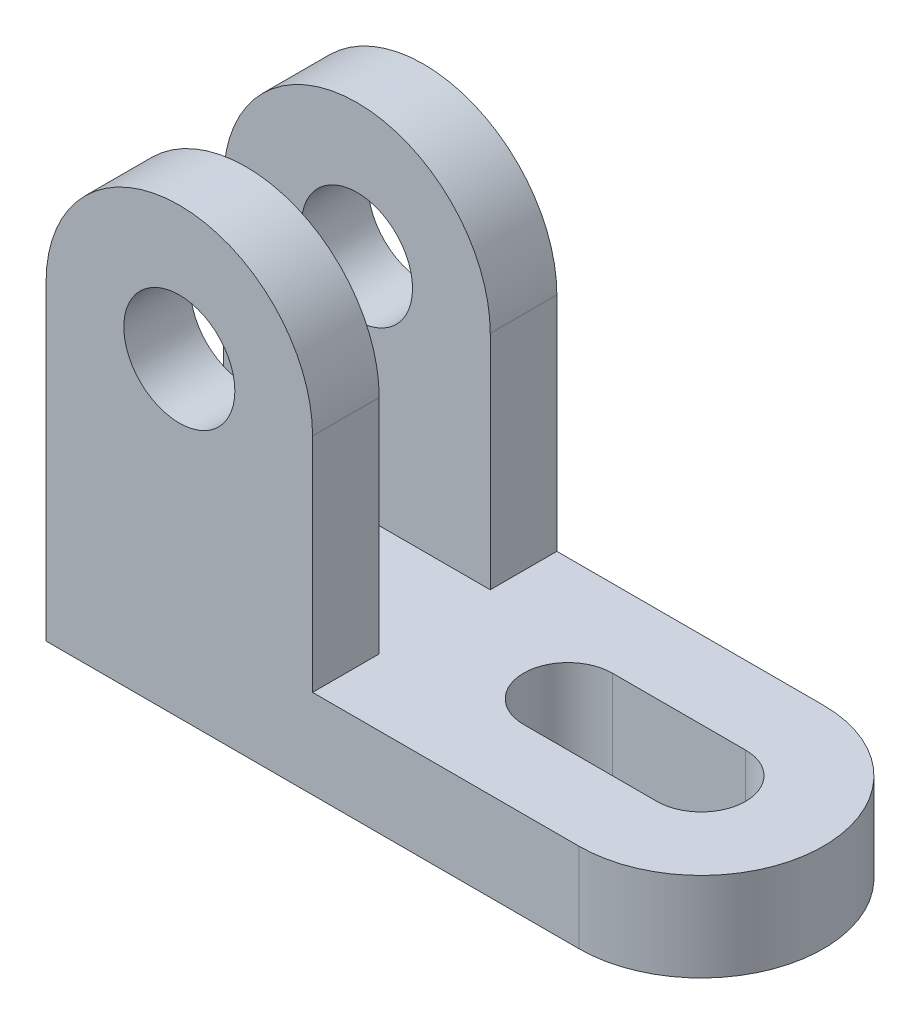
ISO-10303-21;
HEADER;
FILE_DESCRIPTION(('STEP AP214'),'2;1');
FILE_NAME('part.step','',(''),(''),'','','');
FILE_SCHEMA(('AUTOMOTIVE_DESIGN { 1 0 10303 214 1 1 1 1 }'));
ENDSEC;
DATA;
#1=APPLICATION_CONTEXT('core data for automotive mechanical design processes');
#2=APPLICATION_PROTOCOL_DEFINITION('international standard','automotive_design',2000,#1);
#3=PRODUCT_CONTEXT('',#1,'mechanical');
#4=PRODUCT('Part','Part','',(#3));
#5=PRODUCT_RELATED_PRODUCT_CATEGORY('part','',(#4));
#6=PRODUCT_DEFINITION_FORMATION('','',#4);
#7=PRODUCT_DEFINITION_CONTEXT('part definition',#1,'design');
#8=PRODUCT_DEFINITION('design','',#6,#7);
#9=PRODUCT_DEFINITION_SHAPE('','',#8);
#10=(LENGTH_UNIT() NAMED_UNIT(*) SI_UNIT(.MILLI.,.METRE.));
#11=(NAMED_UNIT(*) PLANE_ANGLE_UNIT() SI_UNIT($,.RADIAN.));
#12=(NAMED_UNIT(*) SI_UNIT($,.STERADIAN.) SOLID_ANGLE_UNIT());
#13=UNCERTAINTY_MEASURE_WITH_UNIT(LENGTH_MEASURE(1.E-05),#10,'distance_accuracy_value','');
#14=(GEOMETRIC_REPRESENTATION_CONTEXT(3) GLOBAL_UNCERTAINTY_ASSIGNED_CONTEXT((#13)) GLOBAL_UNIT_ASSIGNED_CONTEXT((#10,
#11,#12)) REPRESENTATION_CONTEXT('',''));
#15=CARTESIAN_POINT('',(0.,0.,0.));
#16=DIRECTION('',(0.,0.,1.));
#17=DIRECTION('',(1.,0.,0.));
#18=AXIS2_PLACEMENT_3D('',#15,#16,#17);
#19=CARTESIAN_POINT('',(0.,16.,0.));
#20=DIRECTION('',(0.,1.,0.));
#21=DIRECTION('',(0.,0.,1.));
#22=AXIS2_PLACEMENT_3D('',#19,#20,#21);
#23=PLANE('',#22);
#24=CARTESIAN_POINT('',(37.,16.,0.));
#25=DIRECTION('',(0.,1.,0.));
#26=DIRECTION('',(0.,0.,1.));
#27=AXIS2_PLACEMENT_3D('',#24,#25,#26);
#28=CIRCLE('',#27,8.);
#29=CARTESIAN_POINT('',(37.,16.,8.00000000000001));
#30=VERTEX_POINT('',#29);
#31=CARTESIAN_POINT('',(37.,16.,-7.99999999999999));
#32=VERTEX_POINT('',#31);
#33=EDGE_CURVE('E214',#30,#32,#28,.T.);
#34=ORIENTED_EDGE('',*,*,#33,.F.);
#35=DIRECTION('',(1.,0.,0.));
#36=VECTOR('',#35,1.);
#37=CARTESIAN_POINT('',(37.,16.,8.00000000000001));
#38=LINE('',#37,#36);
#39=CARTESIAN_POINT('',(13.,16.,8.));
#40=VERTEX_POINT('',#39);
#41=EDGE_CURVE('E226',#40,#30,#38,.T.);
#42=ORIENTED_EDGE('',*,*,#41,.F.);
#43=CARTESIAN_POINT('',(13.,16.,0.));
#44=DIRECTION('',(0.,1.,0.));
#45=DIRECTION('',(0.,0.,1.));
#46=AXIS2_PLACEMENT_3D('',#43,#44,#45);
#47=CIRCLE('',#46,8.);
#48=CARTESIAN_POINT('',(13.,16.,-7.99999999999999));
#49=VERTEX_POINT('',#48);
#50=EDGE_CURVE('E245',#49,#40,#47,.T.);
#51=ORIENTED_EDGE('',*,*,#50,.F.);
#52=DIRECTION('',(-1.,0.,0.));
#53=VECTOR('',#52,1.);
#54=CARTESIAN_POINT('',(37.,16.,-7.99999999999999));
#55=LINE('',#54,#53);
#56=EDGE_CURVE('E241',#32,#49,#55,.T.);
#57=ORIENTED_EDGE('',*,*,#56,.F.);
#58=EDGE_LOOP('',(#34,#42,#51,#57));
#59=FACE_BOUND('',#58,.T.);
#60=DIRECTION('',(1.,0.,0.));
#61=VECTOR('',#60,1.);
#62=CARTESIAN_POINT('',(0.,16.,-22.));
#63=LINE('',#62,#61);
#64=CARTESIAN_POINT('',(-11.,16.,-22.));
#65=VERTEX_POINT('',#64);
#66=CARTESIAN_POINT('',(37.,16.,-22.));
#67=VERTEX_POINT('',#66);
#68=EDGE_CURVE('E169',#65,#67,#63,.T.);
#69=ORIENTED_EDGE('',*,*,#68,.F.);
#70=DIRECTION('',(0.,0.,-1.));
#71=VECTOR('',#70,1.);
#72=CARTESIAN_POINT('',(-11.,16.,-10.));
#73=LINE('',#72,#71);
#74=CARTESIAN_POINT('',(-11.,16.,-10.));
#75=VERTEX_POINT('',#74);
#76=EDGE_CURVE('E151',#75,#65,#73,.T.);
#77=ORIENTED_EDGE('',*,*,#76,.F.);
#78=DIRECTION('',(-1.,0.,0.));
#79=VECTOR('',#78,1.);
#80=CARTESIAN_POINT('',(0.,16.,-10.));
#81=LINE('',#80,#79);
#82=CARTESIAN_POINT('',(-59.,16.,-10.));
#83=VERTEX_POINT('',#82);
#84=EDGE_CURVE('E157',#75,#83,#81,.T.);
#85=ORIENTED_EDGE('',*,*,#84,.T.);
#86=DIRECTION('',(0.,0.,1.));
#87=VECTOR('',#86,1.);
#88=CARTESIAN_POINT('',(-59.,16.,0.));
#89=LINE('',#88,#87);
#90=CARTESIAN_POINT('',(-59.,16.,10.));
#91=VERTEX_POINT('',#90);
#92=EDGE_CURVE('E274',#83,#91,#89,.T.);
#93=ORIENTED_EDGE('',*,*,#92,.T.);
#94=DIRECTION('',(-1.,0.,0.));
#95=VECTOR('',#94,1.);
#96=CARTESIAN_POINT('',(0.,16.,10.));
#97=LINE('',#96,#95);
#98=CARTESIAN_POINT('',(-11.,16.,10.));
#99=VERTEX_POINT('',#98);
#100=EDGE_CURVE('E197',#99,#91,#97,.T.);
#101=ORIENTED_EDGE('',*,*,#100,.F.);
#102=DIRECTION('',(0.,0.,1.));
#103=VECTOR('',#102,1.);
#104=CARTESIAN_POINT('',(-11.,16.,10.));
#105=LINE('',#104,#103);
#106=CARTESIAN_POINT('',(-11.,16.,22.));
#107=VERTEX_POINT('',#106);
#108=EDGE_CURVE('E211',#99,#107,#105,.T.);
#109=ORIENTED_EDGE('',*,*,#108,.T.);
#110=DIRECTION('',(1.,0.,0.));
#111=VECTOR('',#110,1.);
#112=CARTESIAN_POINT('',(0.,16.,22.));
#113=LINE('',#112,#111);
#114=CARTESIAN_POINT('',(37.,16.,22.));
#115=VERTEX_POINT('',#114);
#116=EDGE_CURVE('E265',#107,#115,#113,.T.);
#117=ORIENTED_EDGE('',*,*,#116,.T.);
#118=CARTESIAN_POINT('',(37.,16.,0.));
#119=DIRECTION('',(0.,1.,0.));
#120=DIRECTION('',(0.,0.,1.));
#121=AXIS2_PLACEMENT_3D('',#118,#119,#120);
#122=CIRCLE('',#121,22.);
#123=EDGE_CURVE('E268',#115,#67,#122,.T.);
#124=ORIENTED_EDGE('',*,*,#123,.T.);
#125=EDGE_LOOP('',(#69,#77,#85,#93,#101,#109,#117,#124));
#126=FACE_BOUND('',#125,.T.);
#127=ADVANCED_FACE('F45',(#59,#126),#23,.T.);
#128=CARTESIAN_POINT('',(0.,16.,22.));
#129=DIRECTION('',(0.,0.,-1.));
#130=DIRECTION('',(-1.,0.,0.));
#131=AXIS2_PLACEMENT_3D('',#128,#129,#130);
#132=PLANE('',#131);
#133=DIRECTION('',(1.,0.,0.));
#134=VECTOR('',#133,1.);
#135=CARTESIAN_POINT('',(0.,0.,22.));
#136=LINE('',#135,#134);
#137=CARTESIAN_POINT('',(-59.,0.,22.));
#138=VERTEX_POINT('',#137);
#139=CARTESIAN_POINT('',(37.,0.,22.));
#140=VERTEX_POINT('',#139);
#141=EDGE_CURVE('E255',#138,#140,#136,.T.);
#142=ORIENTED_EDGE('',*,*,#141,.T.);
#143=DIRECTION('',(0.,-1.,0.));
#144=VECTOR('',#143,1.);
#145=CARTESIAN_POINT('',(37.,16.,22.));
#146=LINE('',#145,#144);
#147=EDGE_CURVE('E11',#115,#140,#146,.T.);
#148=ORIENTED_EDGE('',*,*,#147,.F.);
#149=ORIENTED_EDGE('',*,*,#116,.F.);
#150=DIRECTION('',(0.,1.,0.));
#151=VECTOR('',#150,1.);
#152=CARTESIAN_POINT('',(-11.,0.,22.));
#153=LINE('',#152,#151);
#154=CARTESIAN_POINT('',(-11.,56.,22.));
#155=VERTEX_POINT('',#154);
#156=EDGE_CURVE('E69',#107,#155,#153,.T.);
#157=ORIENTED_EDGE('',*,*,#156,.T.);
#158=CARTESIAN_POINT('',(-35.,56.,22.));
#159=DIRECTION('',(0.,0.,1.));
#160=DIRECTION('',(1.,0.,0.));
#161=AXIS2_PLACEMENT_3D('',#158,#159,#160);
#162=CIRCLE('',#161,24.);
#163=CARTESIAN_POINT('',(-59.,56.,22.));
#164=VERTEX_POINT('',#163);
#165=EDGE_CURVE('E186',#155,#164,#162,.T.);
#166=ORIENTED_EDGE('',*,*,#165,.T.);
#167=DIRECTION('',(0.,-1.,0.));
#168=VECTOR('',#167,1.);
#169=CARTESIAN_POINT('',(-59.,16.,22.));
#170=LINE('',#169,#168);
#171=EDGE_CURVE('E277',#164,#138,#170,.T.);
#172=ORIENTED_EDGE('',*,*,#171,.T.);
#173=EDGE_LOOP('',(#142,#148,#149,#157,#166,#172));
#174=FACE_BOUND('',#173,.T.);
#175=CARTESIAN_POINT('',(-35.,56.,22.));
#176=DIRECTION('',(0.,0.,1.));
#177=DIRECTION('',(1.,0.,0.));
#178=AXIS2_PLACEMENT_3D('',#175,#176,#177);
#179=CIRCLE('',#178,10.);
#180=CARTESIAN_POINT('',(-25.,56.,22.));
#181=VERTEX_POINT('',#180);
#182=EDGE_CURVE('E202',#181,#181,#179,.T.);
#183=ORIENTED_EDGE('',*,*,#182,.F.);
#184=EDGE_LOOP('',(#183));
#185=FACE_BOUND('',#184,.T.);
#186=ADVANCED_FACE('F47',(#174,#185),#132,.F.);
#187=CARTESIAN_POINT('',(37.,16.,0.));
#188=DIRECTION('',(0.,-1.,0.));
#189=DIRECTION('',(0.,0.,-1.));
#190=AXIS2_PLACEMENT_3D('',#187,#188,#189);
#191=CYLINDRICAL_SURFACE('',#190,22.);
#192=CARTESIAN_POINT('',(37.,0.,0.));
#193=DIRECTION('',(0.,1.,0.));
#194=DIRECTION('',(0.,0.,1.));
#195=AXIS2_PLACEMENT_3D('',#192,#193,#194);
#196=CIRCLE('',#195,22.);
#197=CARTESIAN_POINT('',(37.,0.,-22.));
#198=VERTEX_POINT('',#197);
#199=EDGE_CURVE('E281',#140,#198,#196,.T.);
#200=ORIENTED_EDGE('',*,*,#199,.T.);
#201=DIRECTION('',(0.,-1.,0.));
#202=VECTOR('',#201,1.);
#203=CARTESIAN_POINT('',(37.,16.,-22.));
#204=LINE('',#203,#202);
#205=EDGE_CURVE('E54',#67,#198,#204,.T.);
#206=ORIENTED_EDGE('',*,*,#205,.F.);
#207=ORIENTED_EDGE('',*,*,#123,.F.);
#208=ORIENTED_EDGE('',*,*,#147,.T.);
#209=EDGE_LOOP('',(#200,#206,#207,#208));
#210=FACE_BOUND('',#209,.T.);
#211=ADVANCED_FACE('F303',(#210),#191,.T.);
#212=CARTESIAN_POINT('',(0.,16.,-22.));
#213=DIRECTION('',(0.,0.,-1.));
#214=DIRECTION('',(-1.,0.,0.));
#215=AXIS2_PLACEMENT_3D('',#212,#213,#214);
#216=PLANE('',#215);
#217=DIRECTION('',(1.,0.,0.));
#218=VECTOR('',#217,1.);
#219=CARTESIAN_POINT('',(0.,0.,-22.));
#220=LINE('',#219,#218);
#221=CARTESIAN_POINT('',(-59.,0.,-22.));
#222=VERTEX_POINT('',#221);
#223=EDGE_CURVE('E285',#222,#198,#220,.T.);
#224=ORIENTED_EDGE('',*,*,#223,.F.);
#225=DIRECTION('',(0.,-1.,0.));
#226=VECTOR('',#225,1.);
#227=CARTESIAN_POINT('',(-59.,16.,-22.));
#228=LINE('',#227,#226);
#229=CARTESIAN_POINT('',(-59.,56.,-22.));
#230=VERTEX_POINT('',#229);
#231=EDGE_CURVE('E294',#230,#222,#228,.T.);
#232=ORIENTED_EDGE('',*,*,#231,.F.);
#233=CARTESIAN_POINT('',(-35.,56.,-22.));
#234=DIRECTION('',(0.,0.,1.));
#235=DIRECTION('',(1.,0.,0.));
#236=AXIS2_PLACEMENT_3D('',#233,#234,#235);
#237=CIRCLE('',#236,24.);
#238=CARTESIAN_POINT('',(-11.,56.,-22.));
#239=VERTEX_POINT('',#238);
#240=EDGE_CURVE('E514',#239,#230,#237,.T.);
#241=ORIENTED_EDGE('',*,*,#240,.F.);
#242=DIRECTION('',(0.,1.,0.));
#243=VECTOR('',#242,1.);
#244=CARTESIAN_POINT('',(-11.,0.,-22.));
#245=LINE('',#244,#243);
#246=EDGE_CURVE('E61',#65,#239,#245,.T.);
#247=ORIENTED_EDGE('',*,*,#246,.F.);
#248=ORIENTED_EDGE('',*,*,#68,.T.);
#249=ORIENTED_EDGE('',*,*,#205,.T.);
#250=EDGE_LOOP('',(#224,#232,#241,#247,#248,#249));
#251=FACE_BOUND('',#250,.T.);
#252=CARTESIAN_POINT('',(-35.,56.,-22.));
#253=DIRECTION('',(0.,0.,1.));
#254=DIRECTION('',(1.,0.,0.));
#255=AXIS2_PLACEMENT_3D('',#252,#253,#254);
#256=CIRCLE('',#255,10.);
#257=CARTESIAN_POINT('',(-25.,56.,-22.));
#258=VERTEX_POINT('',#257);
#259=EDGE_CURVE('E522',#258,#258,#256,.T.);
#260=ORIENTED_EDGE('',*,*,#259,.T.);
#261=EDGE_LOOP('',(#260));
#262=FACE_BOUND('',#261,.T.);
#263=ADVANCED_FACE('F299',(#251,#262),#216,.T.);
#264=CARTESIAN_POINT('',(-59.,16.,0.));
#265=DIRECTION('',(1.,0.,0.));
#266=DIRECTION('',(0.,0.,-1.));
#267=AXIS2_PLACEMENT_3D('',#264,#265,#266);
#268=PLANE('',#267);
#269=DIRECTION('',(0.,0.,1.));
#270=VECTOR('',#269,1.);
#271=CARTESIAN_POINT('',(-59.,0.,0.));
#272=LINE('',#271,#270);
#273=EDGE_CURVE('E269',#222,#138,#272,.T.);
#274=ORIENTED_EDGE('',*,*,#273,.T.);
#275=ORIENTED_EDGE('',*,*,#171,.F.);
#276=DIRECTION('',(0.,0.,1.));
#277=VECTOR('',#276,1.);
#278=CARTESIAN_POINT('',(-59.,56.,10.));
#279=LINE('',#278,#277);
#280=CARTESIAN_POINT('',(-59.,56.,10.));
#281=VERTEX_POINT('',#280);
#282=EDGE_CURVE('E215',#281,#164,#279,.T.);
#283=ORIENTED_EDGE('',*,*,#282,.F.);
#284=DIRECTION('',(0.,1.,0.));
#285=VECTOR('',#284,1.);
#286=CARTESIAN_POINT('',(-59.,0.,10.));
#287=LINE('',#286,#285);
#288=EDGE_CURVE('E194',#91,#281,#287,.T.);
#289=ORIENTED_EDGE('',*,*,#288,.F.);
#290=ORIENTED_EDGE('',*,*,#92,.F.);
#291=DIRECTION('',(0.,1.,0.));
#292=VECTOR('',#291,1.);
#293=CARTESIAN_POINT('',(-59.,0.,-10.));
#294=LINE('',#293,#292);
#295=CARTESIAN_POINT('',(-59.,56.,-10.));
#296=VERTEX_POINT('',#295);
#297=EDGE_CURVE('E163',#83,#296,#294,.T.);
#298=ORIENTED_EDGE('',*,*,#297,.T.);
#299=DIRECTION('',(0.,0.,-1.));
#300=VECTOR('',#299,1.);
#301=CARTESIAN_POINT('',(-59.,56.,-10.));
#302=LINE('',#301,#300);
#303=EDGE_CURVE('E171',#296,#230,#302,.T.);
#304=ORIENTED_EDGE('',*,*,#303,.T.);
#305=ORIENTED_EDGE('',*,*,#231,.T.);
#306=EDGE_LOOP('',(#274,#275,#283,#289,#290,#298,#304,#305));
#307=FACE_BOUND('',#306,.T.);
#308=ADVANCED_FACE('F310',(#307),#268,.F.);
#309=CARTESIAN_POINT('',(0.,0.,0.));
#310=DIRECTION('',(0.,1.,0.));
#311=DIRECTION('',(0.,0.,1.));
#312=AXIS2_PLACEMENT_3D('',#309,#310,#311);
#313=PLANE('',#312);
#314=DIRECTION('',(1.,0.,0.));
#315=VECTOR('',#314,1.);
#316=CARTESIAN_POINT('',(37.,0.,8.00000000000001));
#317=LINE('',#316,#315);
#318=CARTESIAN_POINT('',(13.,0.,8.));
#319=VERTEX_POINT('',#318);
#320=CARTESIAN_POINT('',(37.,0.,8.00000000000001));
#321=VERTEX_POINT('',#320);
#322=EDGE_CURVE('E234',#319,#321,#317,.T.);
#323=ORIENTED_EDGE('',*,*,#322,.T.);
#324=CARTESIAN_POINT('',(37.,0.,0.));
#325=DIRECTION('',(0.,1.,0.));
#326=DIRECTION('',(0.,0.,1.));
#327=AXIS2_PLACEMENT_3D('',#324,#325,#326);
#328=CIRCLE('',#327,8.);
#329=CARTESIAN_POINT('',(37.,0.,-7.99999999999999));
#330=VERTEX_POINT('',#329);
#331=EDGE_CURVE('E221',#321,#330,#328,.T.);
#332=ORIENTED_EDGE('',*,*,#331,.T.);
#333=DIRECTION('',(-1.,0.,0.));
#334=VECTOR('',#333,1.);
#335=CARTESIAN_POINT('',(37.,0.,-7.99999999999999));
#336=LINE('',#335,#334);
#337=CARTESIAN_POINT('',(13.,0.,-8.));
#338=VERTEX_POINT('',#337);
#339=EDGE_CURVE('E225',#330,#338,#336,.T.);
#340=ORIENTED_EDGE('',*,*,#339,.T.);
#341=CARTESIAN_POINT('',(13.,0.,0.));
#342=DIRECTION('',(0.,1.,0.));
#343=DIRECTION('',(0.,0.,1.));
#344=AXIS2_PLACEMENT_3D('',#341,#342,#343);
#345=CIRCLE('',#344,8.);
#346=EDGE_CURVE('E230',#338,#319,#345,.T.);
#347=ORIENTED_EDGE('',*,*,#346,.T.);
#348=EDGE_LOOP('',(#323,#332,#340,#347));
#349=FACE_BOUND('',#348,.T.);
#350=ORIENTED_EDGE('',*,*,#141,.F.);
#351=ORIENTED_EDGE('',*,*,#273,.F.);
#352=ORIENTED_EDGE('',*,*,#223,.T.);
#353=ORIENTED_EDGE('',*,*,#199,.F.);
#354=EDGE_LOOP('',(#350,#351,#352,#353));
#355=FACE_BOUND('',#354,.T.);
#356=ADVANCED_FACE('F308',(#349,#355),#313,.F.);
#357=CARTESIAN_POINT('',(37.,0.,0.));
#358=DIRECTION('',(0.,1.,0.));
#359=DIRECTION('',(0.,0.,1.));
#360=AXIS2_PLACEMENT_3D('',#357,#358,#359);
#361=CYLINDRICAL_SURFACE('',#360,8.);
#362=ORIENTED_EDGE('',*,*,#33,.T.);
#363=DIRECTION('',(0.,1.,0.));
#364=VECTOR('',#363,1.);
#365=CARTESIAN_POINT('',(37.,0.,-7.99999999999999));
#366=LINE('',#365,#364);
#367=EDGE_CURVE('E238',#330,#32,#366,.T.);
#368=ORIENTED_EDGE('',*,*,#367,.F.);
#369=ORIENTED_EDGE('',*,*,#331,.F.);
#370=DIRECTION('',(0.,1.,0.));
#371=VECTOR('',#370,1.);
#372=CARTESIAN_POINT('',(37.,0.,8.00000000000001));
#373=LINE('',#372,#371);
#374=EDGE_CURVE('E252',#321,#30,#373,.T.);
#375=ORIENTED_EDGE('',*,*,#374,.T.);
#376=EDGE_LOOP('',(#362,#368,#369,#375));
#377=FACE_BOUND('',#376,.T.);
#378=ADVANCED_FACE('F350',(#377),#361,.F.);
#379=CARTESIAN_POINT('',(37.,0.,8.00000000000001));
#380=DIRECTION('',(0.,0.,1.));
#381=DIRECTION('',(1.,0.,0.));
#382=AXIS2_PLACEMENT_3D('',#379,#380,#381);
#383=PLANE('',#382);
#384=ORIENTED_EDGE('',*,*,#41,.T.);
#385=ORIENTED_EDGE('',*,*,#374,.F.);
#386=ORIENTED_EDGE('',*,*,#322,.F.);
#387=DIRECTION('',(0.,1.,0.));
#388=VECTOR('',#387,1.);
#389=CARTESIAN_POINT('',(13.,0.,8.));
#390=LINE('',#389,#388);
#391=EDGE_CURVE('E256',#319,#40,#390,.T.);
#392=ORIENTED_EDGE('',*,*,#391,.T.);
#393=EDGE_LOOP('',(#384,#385,#386,#392));
#394=FACE_BOUND('',#393,.T.);
#395=ADVANCED_FACE('F373',(#394),#383,.F.);
#396=CARTESIAN_POINT('',(13.,0.,0.));
#397=DIRECTION('',(0.,1.,0.));
#398=DIRECTION('',(0.,0.,1.));
#399=AXIS2_PLACEMENT_3D('',#396,#397,#398);
#400=CYLINDRICAL_SURFACE('',#399,8.);
#401=ORIENTED_EDGE('',*,*,#50,.T.);
#402=ORIENTED_EDGE('',*,*,#391,.F.);
#403=ORIENTED_EDGE('',*,*,#346,.F.);
#404=DIRECTION('',(0.,1.,0.));
#405=VECTOR('',#404,1.);
#406=CARTESIAN_POINT('',(13.,0.,-7.99999999999999));
#407=LINE('',#406,#405);
#408=EDGE_CURVE('E259',#338,#49,#407,.T.);
#409=ORIENTED_EDGE('',*,*,#408,.T.);
#410=EDGE_LOOP('',(#401,#402,#403,#409));
#411=FACE_BOUND('',#410,.T.);
#412=ADVANCED_FACE('F336',(#411),#400,.F.);
#413=CARTESIAN_POINT('',(37.,0.,-7.99999999999999));
#414=DIRECTION('',(0.,0.,-1.));
#415=DIRECTION('',(-1.,0.,0.));
#416=AXIS2_PLACEMENT_3D('',#413,#414,#415);
#417=PLANE('',#416);
#418=ORIENTED_EDGE('',*,*,#56,.T.);
#419=ORIENTED_EDGE('',*,*,#408,.F.);
#420=ORIENTED_EDGE('',*,*,#339,.F.);
#421=ORIENTED_EDGE('',*,*,#367,.T.);
#422=EDGE_LOOP('',(#418,#419,#420,#421));
#423=FACE_BOUND('',#422,.T.);
#424=ADVANCED_FACE('F327',(#423),#417,.F.);
#425=CARTESIAN_POINT('',(-11.,0.,10.));
#426=DIRECTION('',(1.,0.,0.));
#427=DIRECTION('',(0.,0.,-1.));
#428=AXIS2_PLACEMENT_3D('',#425,#426,#427);
#429=PLANE('',#428);
#430=ORIENTED_EDGE('',*,*,#156,.F.);
#431=ORIENTED_EDGE('',*,*,#108,.F.);
#432=DIRECTION('',(0.,1.,0.));
#433=VECTOR('',#432,1.);
#434=CARTESIAN_POINT('',(-11.,0.,10.));
#435=LINE('',#434,#433);
#436=CARTESIAN_POINT('',(-11.,56.,10.));
#437=VERTEX_POINT('',#436);
#438=EDGE_CURVE('E185',#99,#437,#435,.T.);
#439=ORIENTED_EDGE('',*,*,#438,.T.);
#440=DIRECTION('',(0.,0.,1.));
#441=VECTOR('',#440,1.);
#442=CARTESIAN_POINT('',(-11.,56.,10.));
#443=LINE('',#442,#441);
#444=EDGE_CURVE('E201',#437,#155,#443,.T.);
#445=ORIENTED_EDGE('',*,*,#444,.T.);
#446=EDGE_LOOP('',(#430,#431,#439,#445));
#447=FACE_BOUND('',#446,.T.);
#448=ADVANCED_FACE('F324',(#447),#429,.T.);
#449=CARTESIAN_POINT('',(-35.,56.,10.));
#450=DIRECTION('',(0.,0.,1.));
#451=DIRECTION('',(1.,0.,0.));
#452=AXIS2_PLACEMENT_3D('',#449,#450,#451);
#453=CYLINDRICAL_SURFACE('',#452,10.);
#454=CARTESIAN_POINT('',(-35.,56.,10.));
#455=DIRECTION('',(0.,0.,1.));
#456=DIRECTION('',(1.,0.,0.));
#457=AXIS2_PLACEMENT_3D('',#454,#455,#456);
#458=CIRCLE('',#457,10.);
#459=CARTESIAN_POINT('',(-25.,56.,10.));
#460=VERTEX_POINT('',#459);
#461=EDGE_CURVE('E181',#460,#460,#458,.T.);
#462=ORIENTED_EDGE('',*,*,#461,.F.);
#463=EDGE_LOOP('',(#462));
#464=FACE_BOUND('',#463,.T.);
#465=ORIENTED_EDGE('',*,*,#182,.T.);
#466=EDGE_LOOP('',(#465));
#467=FACE_BOUND('',#466,.T.);
#468=ADVANCED_FACE('F326',(#464,#467),#453,.F.);
#469=CARTESIAN_POINT('',(-35.,56.,10.));
#470=DIRECTION('',(0.,0.,1.));
#471=DIRECTION('',(1.,0.,0.));
#472=AXIS2_PLACEMENT_3D('',#469,#470,#471);
#473=CYLINDRICAL_SURFACE('',#472,24.);
#474=ORIENTED_EDGE('',*,*,#165,.F.);
#475=ORIENTED_EDGE('',*,*,#444,.F.);
#476=CARTESIAN_POINT('',(-35.,56.,10.));
#477=DIRECTION('',(0.,0.,1.));
#478=DIRECTION('',(1.,0.,0.));
#479=AXIS2_PLACEMENT_3D('',#476,#477,#478);
#480=CIRCLE('',#479,24.);
#481=EDGE_CURVE('E190',#437,#281,#480,.T.);
#482=ORIENTED_EDGE('',*,*,#481,.T.);
#483=ORIENTED_EDGE('',*,*,#282,.T.);
#484=EDGE_LOOP('',(#474,#475,#482,#483));
#485=FACE_BOUND('',#484,.T.);
#486=ADVANCED_FACE('F317',(#485),#473,.T.);
#487=CARTESIAN_POINT('',(0.,0.,10.));
#488=DIRECTION('',(0.,0.,1.));
#489=DIRECTION('',(1.,0.,0.));
#490=AXIS2_PLACEMENT_3D('',#487,#488,#489);
#491=PLANE('',#490);
#492=ORIENTED_EDGE('',*,*,#461,.T.);
#493=EDGE_LOOP('',(#492));
#494=FACE_BOUND('',#493,.T.);
#495=ORIENTED_EDGE('',*,*,#438,.F.);
#496=ORIENTED_EDGE('',*,*,#100,.T.);
#497=ORIENTED_EDGE('',*,*,#288,.T.);
#498=ORIENTED_EDGE('',*,*,#481,.F.);
#499=EDGE_LOOP('',(#495,#496,#497,#498));
#500=FACE_BOUND('',#499,.T.);
#501=ADVANCED_FACE('F323',(#494,#500),#491,.F.);
#502=CARTESIAN_POINT('',(-11.,0.,-10.));
#503=DIRECTION('',(-1.,0.,0.));
#504=DIRECTION('',(0.,0.,1.));
#505=AXIS2_PLACEMENT_3D('',#502,#503,#504);
#506=PLANE('',#505);
#507=ORIENTED_EDGE('',*,*,#246,.T.);
#508=DIRECTION('',(0.,0.,-1.));
#509=VECTOR('',#508,1.);
#510=CARTESIAN_POINT('',(-11.,56.,-10.));
#511=LINE('',#510,#509);
#512=CARTESIAN_POINT('',(-11.,56.,-10.));
#513=VERTEX_POINT('',#512);
#514=EDGE_CURVE('E154',#513,#239,#511,.T.);
#515=ORIENTED_EDGE('',*,*,#514,.F.);
#516=DIRECTION('',(0.,1.,0.));
#517=VECTOR('',#516,1.);
#518=CARTESIAN_POINT('',(-11.,0.,-10.));
#519=LINE('',#518,#517);
#520=EDGE_CURVE('E147',#75,#513,#519,.T.);
#521=ORIENTED_EDGE('',*,*,#520,.F.);
#522=ORIENTED_EDGE('',*,*,#76,.T.);
#523=EDGE_LOOP('',(#507,#515,#521,#522));
#524=FACE_BOUND('',#523,.T.);
#525=ADVANCED_FACE('F149',(#524),#506,.F.);
#526=CARTESIAN_POINT('',(-35.,56.,-10.));
#527=DIRECTION('',(0.,0.,-1.));
#528=DIRECTION('',(-1.,0.,0.));
#529=AXIS2_PLACEMENT_3D('',#526,#527,#528);
#530=CYLINDRICAL_SURFACE('',#529,24.);
#531=ORIENTED_EDGE('',*,*,#240,.T.);
#532=ORIENTED_EDGE('',*,*,#303,.F.);
#533=CARTESIAN_POINT('',(-35.,56.,-10.));
#534=DIRECTION('',(0.,0.,1.));
#535=DIRECTION('',(1.,0.,0.));
#536=AXIS2_PLACEMENT_3D('',#533,#534,#535);
#537=CIRCLE('',#536,24.);
#538=EDGE_CURVE('E172',#513,#296,#537,.T.);
#539=ORIENTED_EDGE('',*,*,#538,.F.);
#540=ORIENTED_EDGE('',*,*,#514,.T.);
#541=EDGE_LOOP('',(#531,#532,#539,#540));
#542=FACE_BOUND('',#541,.T.);
#543=ADVANCED_FACE('F473',(#542),#530,.T.);
#544=CARTESIAN_POINT('',(-35.,56.,-10.));
#545=DIRECTION('',(0.,0.,-1.));
#546=DIRECTION('',(-1.,0.,0.));
#547=AXIS2_PLACEMENT_3D('',#544,#545,#546);
#548=CYLINDRICAL_SURFACE('',#547,10.);
#549=CARTESIAN_POINT('',(-35.,56.,-10.));
#550=DIRECTION('',(0.,0.,1.));
#551=DIRECTION('',(1.,0.,0.));
#552=AXIS2_PLACEMENT_3D('',#549,#550,#551);
#553=CIRCLE('',#552,10.);
#554=CARTESIAN_POINT('',(-25.,56.,-10.));
#555=VERTEX_POINT('',#554);
#556=EDGE_CURVE('E158',#555,#555,#553,.T.);
#557=ORIENTED_EDGE('',*,*,#556,.T.);
#558=EDGE_LOOP('',(#557));
#559=FACE_BOUND('',#558,.T.);
#560=ORIENTED_EDGE('',*,*,#259,.F.);
#561=EDGE_LOOP('',(#560));
#562=FACE_BOUND('',#561,.T.);
#563=ADVANCED_FACE('F480',(#559,#562),#548,.F.);
#564=CARTESIAN_POINT('',(0.,0.,-10.));
#565=DIRECTION('',(0.,0.,-1.));
#566=DIRECTION('',(1.,0.,0.));
#567=AXIS2_PLACEMENT_3D('',#564,#565,#566);
#568=PLANE('',#567);
#569=ORIENTED_EDGE('',*,*,#556,.F.);
#570=EDGE_LOOP('',(#569));
#571=FACE_BOUND('',#570,.T.);
#572=ORIENTED_EDGE('',*,*,#520,.T.);
#573=ORIENTED_EDGE('',*,*,#538,.T.);
#574=ORIENTED_EDGE('',*,*,#297,.F.);
#575=ORIENTED_EDGE('',*,*,#84,.F.);
#576=EDGE_LOOP('',(#572,#573,#574,#575));
#577=FACE_BOUND('',#576,.T.);
#578=ADVANCED_FACE('F161',(#571,#577),#568,.F.);
#579=CLOSED_SHELL('',(#127,#186,#211,#263,#308,#356,#378,#395,#412,#424,#448,#468,#486,#501,
#525,#543,#563,#578));
#580=MANIFOLD_SOLID_BREP('B2',#579);
#581=ADVANCED_BREP_SHAPE_REPRESENTATION('',(#18,#580),#14);
#582=SHAPE_DEFINITION_REPRESENTATION(#9,#581);
ENDSEC;
END-ISO-10303-21;
